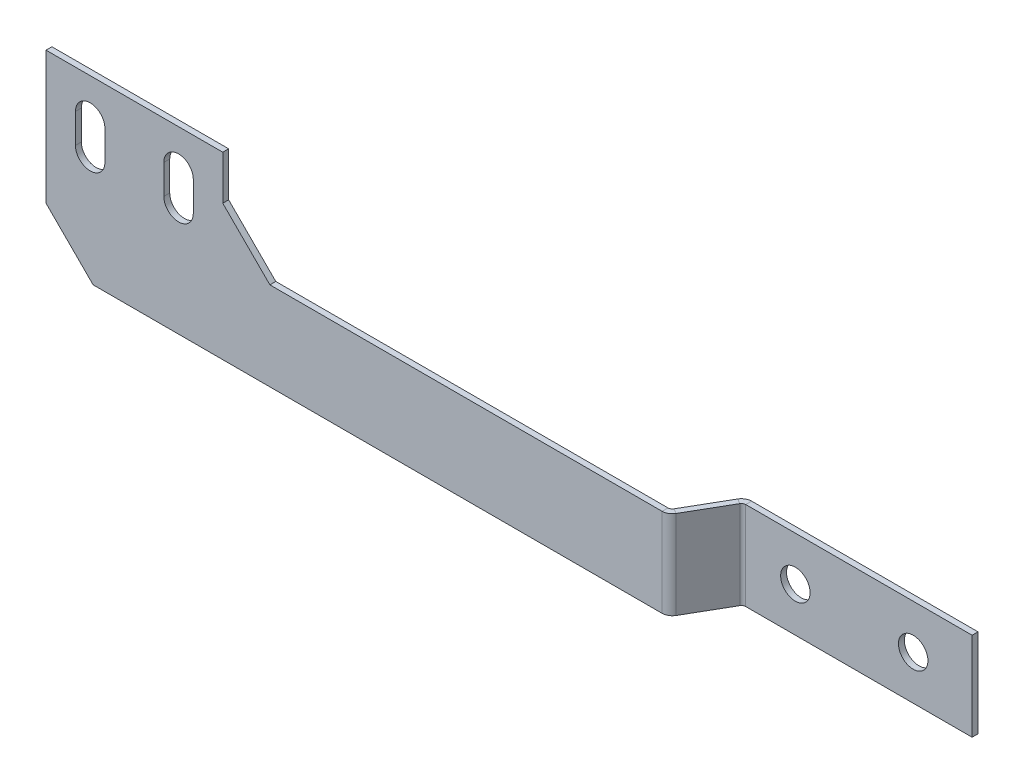
ISO-10303-21;
HEADER;
FILE_DESCRIPTION(('STEP AP214'),'2;1');
FILE_NAME('part.step','',(''),(''),'','','');
FILE_SCHEMA(('AUTOMOTIVE_DESIGN { 1 0 10303 214 1 1 1 1 }'));
ENDSEC;
DATA;
#1=APPLICATION_CONTEXT('core data for automotive mechanical design processes');
#2=APPLICATION_PROTOCOL_DEFINITION('international standard','automotive_design',2000,#1);
#3=PRODUCT_CONTEXT('',#1,'mechanical');
#4=PRODUCT('Part','Part','',(#3));
#5=PRODUCT_RELATED_PRODUCT_CATEGORY('part','',(#4));
#6=PRODUCT_DEFINITION_FORMATION('','',#4);
#7=PRODUCT_DEFINITION_CONTEXT('part definition',#1,'design');
#8=PRODUCT_DEFINITION('design','',#6,#7);
#9=PRODUCT_DEFINITION_SHAPE('','',#8);
#10=(LENGTH_UNIT() NAMED_UNIT(*) SI_UNIT(.MILLI.,.METRE.));
#11=(NAMED_UNIT(*) PLANE_ANGLE_UNIT() SI_UNIT($,.RADIAN.));
#12=(NAMED_UNIT(*) SI_UNIT($,.STERADIAN.) SOLID_ANGLE_UNIT());
#13=UNCERTAINTY_MEASURE_WITH_UNIT(LENGTH_MEASURE(1.E-05),#10,'distance_accuracy_value','');
#14=(GEOMETRIC_REPRESENTATION_CONTEXT(3) GLOBAL_UNCERTAINTY_ASSIGNED_CONTEXT((#13)) GLOBAL_UNIT_ASSIGNED_CONTEXT((#10,
#11,#12)) REPRESENTATION_CONTEXT('',''));
#15=CARTESIAN_POINT('',(0.,0.,0.));
#16=DIRECTION('',(0.,0.,1.));
#17=DIRECTION('',(1.,0.,0.));
#18=AXIS2_PLACEMENT_3D('',#15,#16,#17);
#19=CARTESIAN_POINT('',(-34.6726497308104,-7.5,8.09326673973658));
#20=DIRECTION('',(0.,1.,0.));
#21=DIRECTION('',(0.,0.,1.));
#22=AXIS2_PLACEMENT_3D('',#19,#20,#21);
#23=PLANE('',#22);
#24=DIRECTION('',(0.866025403784435,0.,0.500000000000006));
#25=VECTOR('',#24,1.);
#26=CARTESIAN_POINT('',(-33.8826613574782,-7.5,6.72496673973658));
#27=LINE('',#26,#25);
#28=CARTESIAN_POINT('',(-33.8826613574782,-7.5,6.72496673973658));
#29=VERTEX_POINT('',#28);
#30=CARTESIAN_POINT('',(-33.0166359536938,-7.5,7.22496673973658));
#31=VERTEX_POINT('',#30);
#32=EDGE_CURVE('E364',#29,#31,#27,.T.);
#33=ORIENTED_EDGE('',*,*,#32,.F.);
#34=DIRECTION('',(-0.500000000000004,0.,0.866025403784436));
#35=VECTOR('',#34,1.);
#36=CARTESIAN_POINT('',(-22.2113248654051,-7.5,-13.4903810567667));
#37=LINE('',#36,#35);
#38=CARTESIAN_POINT('',(-29.9239629695477,-7.5,-0.131700000000011));
#39=VERTEX_POINT('',#38);
#40=EDGE_CURVE('E373',#39,#29,#37,.T.);
#41=ORIENTED_EDGE('',*,*,#40,.F.);
#42=DIRECTION('',(0.866025403784436,0.,0.500000000000004));
#43=VECTOR('',#42,1.);
#44=CARTESIAN_POINT('',(-29.0579375657633,-7.5,0.368299999999995));
#45=LINE('',#44,#43);
#46=CARTESIAN_POINT('',(-29.0579375657633,-7.5,0.368299999999993));
#47=VERTEX_POINT('',#46);
#48=EDGE_CURVE('E384',#47,#39,#45,.F.);
#49=ORIENTED_EDGE('',*,*,#48,.F.);
#50=DIRECTION('',(0.500000000000004,0.,-0.866025403784436));
#51=VECTOR('',#50,1.);
#52=CARTESIAN_POINT('',(-33.806624327026,-7.5,8.59326673973658));
#53=LINE('',#52,#51);
#54=EDGE_CURVE('E378',#47,#31,#53,.F.);
#55=ORIENTED_EDGE('',*,*,#54,.T.);
#56=EDGE_LOOP('',(#33,#41,#49,#55));
#57=FACE_BOUND('',#56,.T.);
#58=ADVANCED_FACE('F91',(#57),#23,.F.);
#59=CARTESIAN_POINT('',(-29.7113248654052,7.5,-0.500000000000004));
#60=DIRECTION('',(0.,-1.,0.));
#61=DIRECTION('',(0.,0.,-1.));
#62=AXIS2_PLACEMENT_3D('',#59,#60,#61);
#63=PLANE('',#62);
#64=DIRECTION('',(0.866025403784435,0.,0.500000000000006));
#65=VECTOR('',#64,1.);
#66=CARTESIAN_POINT('',(-33.8826613574782,7.5,6.72496673973658));
#67=LINE('',#66,#65);
#68=CARTESIAN_POINT('',(-33.8826613574782,7.5,6.72496673973658));
#69=VERTEX_POINT('',#68);
#70=CARTESIAN_POINT('',(-33.0166359536938,7.5,7.22496673973659));
#71=VERTEX_POINT('',#70);
#72=EDGE_CURVE('E354',#69,#71,#67,.T.);
#73=ORIENTED_EDGE('',*,*,#72,.T.);
#74=DIRECTION('',(-0.500000000000004,0.,0.866025403784436));
#75=VECTOR('',#74,1.);
#76=CARTESIAN_POINT('',(-28.8452994616208,7.5,0.));
#77=LINE('',#76,#75);
#78=CARTESIAN_POINT('',(-29.0579375657633,7.49999999999999,0.368299999999993));
#79=VERTEX_POINT('',#78);
#80=EDGE_CURVE('E376',#71,#79,#77,.F.);
#81=ORIENTED_EDGE('',*,*,#80,.T.);
#82=DIRECTION('',(0.866025403784436,0.,0.500000000000004));
#83=VECTOR('',#82,1.);
#84=CARTESIAN_POINT('',(-29.9239629695477,7.5,-0.131700000000007));
#85=LINE('',#84,#83);
#86=CARTESIAN_POINT('',(-29.9239629695477,7.49999999999999,-0.131700000000011));
#87=VERTEX_POINT('',#86);
#88=EDGE_CURVE('E367',#79,#87,#85,.F.);
#89=ORIENTED_EDGE('',*,*,#88,.T.);
#90=DIRECTION('',(0.500000000000004,0.,-0.866025403784436));
#91=VECTOR('',#90,1.);
#92=CARTESIAN_POINT('',(-22.2113248654051,7.5,-13.4903810567667));
#93=LINE('',#92,#91);
#94=EDGE_CURVE('E370',#69,#87,#93,.T.);
#95=ORIENTED_EDGE('',*,*,#94,.F.);
#96=EDGE_LOOP('',(#73,#81,#89,#95));
#97=FACE_BOUND('',#96,.T.);
#98=ADVANCED_FACE('F500',(#97),#63,.F.);
#99=CARTESIAN_POINT('',(-22.2113248654051,0.,-13.4903810567667));
#100=DIRECTION('',(0.866025403784436,0.,0.500000000000004));
#101=DIRECTION('',(0.500000000000004,0.,-0.866025403784436));
#102=AXIS2_PLACEMENT_3D('',#99,#100,#101);
#103=PLANE('',#102);
#104=DIRECTION('',(0.,1.,0.));
#105=VECTOR('',#104,1.);
#106=CARTESIAN_POINT('',(-33.8826613574782,7.5,6.72496673973658));
#107=LINE('',#106,#105);
#108=EDGE_CURVE('E360',#69,#29,#107,.F.);
#109=ORIENTED_EDGE('',*,*,#108,.F.);
#110=ORIENTED_EDGE('',*,*,#94,.T.);
#111=DIRECTION('',(0.,-1.,0.));
#112=VECTOR('',#111,1.);
#113=CARTESIAN_POINT('',(-29.9239629695477,7.5,-0.131700000000011));
#114=LINE('',#113,#112);
#115=EDGE_CURVE('E381',#39,#87,#114,.F.);
#116=ORIENTED_EDGE('',*,*,#115,.F.);
#117=ORIENTED_EDGE('',*,*,#40,.T.);
#118=EDGE_LOOP('',(#109,#110,#116,#117));
#119=FACE_BOUND('',#118,.T.);
#120=ADVANCED_FACE('F506',(#119),#103,.F.);
#121=CARTESIAN_POINT('',(-21.3452994616206,0.,-12.9903810567667));
#122=DIRECTION('',(0.866025403784436,0.,0.500000000000004));
#123=DIRECTION('',(0.500000000000004,0.,-0.866025403784436));
#124=AXIS2_PLACEMENT_3D('',#121,#122,#123);
#125=PLANE('',#124);
#126=ORIENTED_EDGE('',*,*,#80,.F.);
#127=DIRECTION('',(0.,1.,0.));
#128=VECTOR('',#127,1.);
#129=CARTESIAN_POINT('',(-33.0166359536938,7.5,7.22496673973659));
#130=LINE('',#129,#128);
#131=EDGE_CURVE('E347',#71,#31,#130,.F.);
#132=ORIENTED_EDGE('',*,*,#131,.T.);
#133=ORIENTED_EDGE('',*,*,#54,.F.);
#134=DIRECTION('',(0.,-1.,0.));
#135=VECTOR('',#134,1.);
#136=CARTESIAN_POINT('',(-29.0579375657633,7.5,0.368299999999995));
#137=LINE('',#136,#135);
#138=EDGE_CURVE('E387',#79,#47,#137,.T.);
#139=ORIENTED_EDGE('',*,*,#138,.F.);
#140=EDGE_LOOP('',(#126,#132,#133,#139));
#141=FACE_BOUND('',#140,.T.);
#142=ADVANCED_FACE('F555',(#141),#125,.T.);
#143=CARTESIAN_POINT('',(10.,-7.5,-1.));
#144=DIRECTION('',(0.,-1.,0.));
#145=DIRECTION('',(0.,0.,-1.));
#146=AXIS2_PLACEMENT_3D('',#143,#144,#145);
#147=PLANE('',#146);
#148=DIRECTION('',(1.,0.,0.));
#149=VECTOR('',#148,1.);
#150=CARTESIAN_POINT('',(10.,-7.5,0.));
#151=LINE('',#150,#149);
#152=CARTESIAN_POINT('',(-28.4200232533357,-7.5,0.));
#153=VERTEX_POINT('',#152);
#154=CARTESIAN_POINT('',(10.,-7.5,0.));
#155=VERTEX_POINT('',#154);
#156=EDGE_CURVE('E423',#153,#155,#151,.T.);
#157=ORIENTED_EDGE('',*,*,#156,.F.);
#158=DIRECTION('',(0.,0.,-1.));
#159=VECTOR('',#158,1.);
#160=CARTESIAN_POINT('',(-28.4200232533357,-7.5,0.));
#161=LINE('',#160,#159);
#162=CARTESIAN_POINT('',(-28.4200232533357,-7.5,-1.));
#163=VERTEX_POINT('',#162);
#164=EDGE_CURVE('E398',#153,#163,#161,.T.);
#165=ORIENTED_EDGE('',*,*,#164,.T.);
#166=DIRECTION('',(1.,0.,0.));
#167=VECTOR('',#166,1.);
#168=CARTESIAN_POINT('',(10.,-7.5,-1.));
#169=LINE('',#168,#167);
#170=CARTESIAN_POINT('',(10.,-7.5,-1.));
#171=VERTEX_POINT('',#170);
#172=EDGE_CURVE('E426',#163,#171,#169,.T.);
#173=ORIENTED_EDGE('',*,*,#172,.T.);
#174=DIRECTION('',(0.,0.,1.));
#175=VECTOR('',#174,1.);
#176=CARTESIAN_POINT('',(10.,-7.5,-1.));
#177=LINE('',#176,#175);
#178=EDGE_CURVE('E435',#171,#155,#177,.T.);
#179=ORIENTED_EDGE('',*,*,#178,.T.);
#180=EDGE_LOOP('',(#157,#165,#173,#179));
#181=FACE_BOUND('',#180,.T.);
#182=ADVANCED_FACE('F542',(#181),#147,.T.);
#183=CARTESIAN_POINT('',(0.,0.,-1.));
#184=DIRECTION('',(0.,0.,-1.));
#185=DIRECTION('',(-1.,0.,0.));
#186=AXIS2_PLACEMENT_3D('',#183,#184,#185);
#187=PLANE('',#186);
#188=CARTESIAN_POINT('',(0.,0.,-1.));
#189=DIRECTION('',(0.,0.,1.));
#190=DIRECTION('',(1.,0.,0.));
#191=AXIS2_PLACEMENT_3D('',#188,#189,#190);
#192=CIRCLE('',#191,2.5);
#193=CARTESIAN_POINT('',(2.5,0.,-1.));
#194=VERTEX_POINT('',#193);
#195=EDGE_CURVE('E414',#194,#194,#192,.T.);
#196=ORIENTED_EDGE('',*,*,#195,.T.);
#197=EDGE_LOOP('',(#196));
#198=FACE_BOUND('',#197,.T.);
#199=CARTESIAN_POINT('',(-20.,0.,-1.));
#200=DIRECTION('',(0.,0.,1.));
#201=DIRECTION('',(1.,0.,0.));
#202=AXIS2_PLACEMENT_3D('',#199,#200,#201);
#203=CIRCLE('',#202,2.5);
#204=CARTESIAN_POINT('',(-17.5,0.,-1.));
#205=VERTEX_POINT('',#204);
#206=EDGE_CURVE('E420',#205,#205,#203,.T.);
#207=ORIENTED_EDGE('',*,*,#206,.T.);
#208=EDGE_LOOP('',(#207));
#209=FACE_BOUND('',#208,.T.);
#210=ORIENTED_EDGE('',*,*,#172,.F.);
#211=DIRECTION('',(0.,-1.,0.));
#212=VECTOR('',#211,1.);
#213=CARTESIAN_POINT('',(-28.4200232533357,-7.5,-1.));
#214=LINE('',#213,#212);
#215=CARTESIAN_POINT('',(-28.4200232533357,7.5,-1.));
#216=VERTEX_POINT('',#215);
#217=EDGE_CURVE('E391',#163,#216,#214,.F.);
#218=ORIENTED_EDGE('',*,*,#217,.T.);
#219=DIRECTION('',(-1.,0.,0.));
#220=VECTOR('',#219,1.);
#221=CARTESIAN_POINT('',(-30.,7.5,-1.));
#222=LINE('',#221,#220);
#223=CARTESIAN_POINT('',(10.,7.5,-1.));
#224=VERTEX_POINT('',#223);
#225=EDGE_CURVE('E432',#224,#216,#222,.T.);
#226=ORIENTED_EDGE('',*,*,#225,.F.);
#227=DIRECTION('',(0.,1.,0.));
#228=VECTOR('',#227,1.);
#229=CARTESIAN_POINT('',(10.,7.5,-1.));
#230=LINE('',#229,#228);
#231=EDGE_CURVE('E428',#171,#224,#230,.T.);
#232=ORIENTED_EDGE('',*,*,#231,.F.);
#233=EDGE_LOOP('',(#210,#218,#226,#232));
#234=FACE_BOUND('',#233,.T.);
#235=ADVANCED_FACE('F538',(#198,#209,#234),#187,.T.);
#236=CARTESIAN_POINT('',(0.,0.,0.));
#237=DIRECTION('',(0.,0.,-1.));
#238=DIRECTION('',(-1.,0.,0.));
#239=AXIS2_PLACEMENT_3D('',#236,#237,#238);
#240=PLANE('',#239);
#241=CARTESIAN_POINT('',(-20.,0.,0.));
#242=DIRECTION('',(0.,0.,1.));
#243=DIRECTION('',(1.,0.,0.));
#244=AXIS2_PLACEMENT_3D('',#241,#242,#243);
#245=CIRCLE('',#244,2.5);
#246=CARTESIAN_POINT('',(-17.5,0.,0.));
#247=VERTEX_POINT('',#246);
#248=EDGE_CURVE('E417',#247,#247,#245,.T.);
#249=ORIENTED_EDGE('',*,*,#248,.F.);
#250=EDGE_LOOP('',(#249));
#251=FACE_BOUND('',#250,.T.);
#252=CARTESIAN_POINT('',(0.,0.,0.));
#253=DIRECTION('',(0.,0.,1.));
#254=DIRECTION('',(1.,0.,0.));
#255=AXIS2_PLACEMENT_3D('',#252,#253,#254);
#256=CIRCLE('',#255,2.5);
#257=CARTESIAN_POINT('',(2.5,0.,0.));
#258=VERTEX_POINT('',#257);
#259=EDGE_CURVE('E411',#258,#258,#256,.T.);
#260=ORIENTED_EDGE('',*,*,#259,.F.);
#261=EDGE_LOOP('',(#260));
#262=FACE_BOUND('',#261,.T.);
#263=DIRECTION('',(0.,-1.,0.));
#264=VECTOR('',#263,1.);
#265=CARTESIAN_POINT('',(-28.4200232533357,-7.5,0.));
#266=LINE('',#265,#264);
#267=CARTESIAN_POINT('',(-28.4200232533357,7.49999999999999,0.));
#268=VERTEX_POINT('',#267);
#269=EDGE_CURVE('E404',#153,#268,#266,.F.);
#270=ORIENTED_EDGE('',*,*,#269,.F.);
#271=ORIENTED_EDGE('',*,*,#156,.T.);
#272=DIRECTION('',(0.,1.,0.));
#273=VECTOR('',#272,1.);
#274=CARTESIAN_POINT('',(10.,7.5,0.));
#275=LINE('',#274,#273);
#276=CARTESIAN_POINT('',(10.,7.5,0.));
#277=VERTEX_POINT('',#276);
#278=EDGE_CURVE('E437',#155,#277,#275,.T.);
#279=ORIENTED_EDGE('',*,*,#278,.T.);
#280=DIRECTION('',(-1.,0.,0.));
#281=VECTOR('',#280,1.);
#282=CARTESIAN_POINT('',(-30.,7.5,0.));
#283=LINE('',#282,#281);
#284=EDGE_CURVE('E429',#277,#268,#283,.T.);
#285=ORIENTED_EDGE('',*,*,#284,.T.);
#286=EDGE_LOOP('',(#270,#271,#279,#285));
#287=FACE_BOUND('',#286,.T.);
#288=ADVANCED_FACE('F541',(#251,#262,#287),#240,.F.);
#289=CARTESIAN_POINT('',(-30.,7.5,-1.));
#290=DIRECTION('',(0.,1.,0.));
#291=DIRECTION('',(-1.,0.,0.));
#292=AXIS2_PLACEMENT_3D('',#289,#290,#291);
#293=PLANE('',#292);
#294=DIRECTION('',(0.,0.,-1.));
#295=VECTOR('',#294,1.);
#296=CARTESIAN_POINT('',(-28.4200232533357,7.49999999999999,0.));
#297=LINE('',#296,#295);
#298=EDGE_CURVE('E408',#268,#216,#297,.T.);
#299=ORIENTED_EDGE('',*,*,#298,.F.);
#300=ORIENTED_EDGE('',*,*,#284,.F.);
#301=DIRECTION('',(0.,0.,1.));
#302=VECTOR('',#301,1.);
#303=CARTESIAN_POINT('',(10.,7.5,-1.));
#304=LINE('',#303,#302);
#305=EDGE_CURVE('E442',#224,#277,#304,.T.);
#306=ORIENTED_EDGE('',*,*,#305,.F.);
#307=ORIENTED_EDGE('',*,*,#225,.T.);
#308=EDGE_LOOP('',(#299,#300,#306,#307));
#309=FACE_BOUND('',#308,.T.);
#310=ADVANCED_FACE('F546',(#309),#293,.T.);
#311=CARTESIAN_POINT('',(10.,7.5,-1.));
#312=DIRECTION('',(1.,0.,0.));
#313=DIRECTION('',(0.,0.,-1.));
#314=AXIS2_PLACEMENT_3D('',#311,#312,#313);
#315=PLANE('',#314);
#316=ORIENTED_EDGE('',*,*,#278,.F.);
#317=ORIENTED_EDGE('',*,*,#178,.F.);
#318=ORIENTED_EDGE('',*,*,#231,.T.);
#319=ORIENTED_EDGE('',*,*,#305,.T.);
#320=EDGE_LOOP('',(#316,#317,#318,#319));
#321=FACE_BOUND('',#320,.T.);
#322=ADVANCED_FACE('F536',(#321),#315,.T.);
#323=CARTESIAN_POINT('',(-20.,0.,-1.));
#324=DIRECTION('',(0.,0.,1.));
#325=DIRECTION('',(1.,0.,0.));
#326=AXIS2_PLACEMENT_3D('',#323,#324,#325);
#327=CYLINDRICAL_SURFACE('',#326,2.5);
#328=ORIENTED_EDGE('',*,*,#206,.F.);
#329=EDGE_LOOP('',(#328));
#330=FACE_BOUND('',#329,.T.);
#331=ORIENTED_EDGE('',*,*,#248,.T.);
#332=EDGE_LOOP('',(#331));
#333=FACE_BOUND('',#332,.T.);
#334=ADVANCED_FACE('F532',(#330,#333),#327,.F.);
#335=CARTESIAN_POINT('',(0.,0.,-1.));
#336=DIRECTION('',(0.,0.,1.));
#337=DIRECTION('',(1.,0.,0.));
#338=AXIS2_PLACEMENT_3D('',#335,#336,#337);
#339=CYLINDRICAL_SURFACE('',#338,2.5);
#340=ORIENTED_EDGE('',*,*,#195,.F.);
#341=EDGE_LOOP('',(#340));
#342=FACE_BOUND('',#341,.T.);
#343=ORIENTED_EDGE('',*,*,#259,.T.);
#344=EDGE_LOOP('',(#343));
#345=FACE_BOUND('',#344,.T.);
#346=ADVANCED_FACE('F525',(#342,#345),#339,.F.);
#347=CARTESIAN_POINT('',(-28.4200232533357,7.49999999999999,0.736599999999995));
#348=DIRECTION('',(0.,1.,0.));
#349=DIRECTION('',(0.,0.,1.));
#350=AXIS2_PLACEMENT_3D('',#347,#348,#349);
#351=PLANE('',#350);
#352=ORIENTED_EDGE('',*,*,#88,.F.);
#353=CARTESIAN_POINT('',(-28.4200232533357,7.49999999999999,0.736599999999995));
#354=DIRECTION('',(0.,-1.,0.));
#355=DIRECTION('',(0.,0.,-1.));
#356=AXIS2_PLACEMENT_3D('',#353,#354,#355);
#357=CIRCLE('',#356,0.736599999999998);
#358=EDGE_CURVE('E401',#268,#79,#357,.F.);
#359=ORIENTED_EDGE('',*,*,#358,.F.);
#360=ORIENTED_EDGE('',*,*,#298,.T.);
#361=CARTESIAN_POINT('',(-28.4200232533357,7.49999999999999,0.736599999999995));
#362=DIRECTION('',(0.,-1.,0.));
#363=DIRECTION('',(0.,0.,-1.));
#364=AXIS2_PLACEMENT_3D('',#361,#362,#363);
#365=CIRCLE('',#364,1.7366);
#366=EDGE_CURVE('E394',#216,#87,#365,.F.);
#367=ORIENTED_EDGE('',*,*,#366,.T.);
#368=EDGE_LOOP('',(#352,#359,#360,#367));
#369=FACE_BOUND('',#368,.T.);
#370=ADVANCED_FACE('F522',(#369),#351,.T.);
#371=CARTESIAN_POINT('',(-28.4200232533357,-7.5,0.736599999999995));
#372=DIRECTION('',(0.,1.,0.));
#373=DIRECTION('',(0.,0.,1.));
#374=AXIS2_PLACEMENT_3D('',#371,#372,#373);
#375=PLANE('',#374);
#376=CARTESIAN_POINT('',(-28.4200232533357,-7.5,0.736599999999995));
#377=DIRECTION('',(0.,-1.,0.));
#378=DIRECTION('',(0.,0.,-1.));
#379=AXIS2_PLACEMENT_3D('',#376,#377,#378);
#380=CIRCLE('',#379,0.736599999999998);
#381=EDGE_CURVE('E372',#47,#153,#380,.T.);
#382=ORIENTED_EDGE('',*,*,#381,.F.);
#383=ORIENTED_EDGE('',*,*,#48,.T.);
#384=CARTESIAN_POINT('',(-28.4200232533357,-7.5,0.736599999999995));
#385=DIRECTION('',(0.,-1.,0.));
#386=DIRECTION('',(0.,0.,-1.));
#387=AXIS2_PLACEMENT_3D('',#384,#385,#386);
#388=CIRCLE('',#387,1.7366);
#389=EDGE_CURVE('E395',#39,#163,#388,.T.);
#390=ORIENTED_EDGE('',*,*,#389,.T.);
#391=ORIENTED_EDGE('',*,*,#164,.F.);
#392=EDGE_LOOP('',(#382,#383,#390,#391));
#393=FACE_BOUND('',#392,.T.);
#394=ADVANCED_FACE('F516',(#393),#375,.F.);
#395=CARTESIAN_POINT('',(-28.4200232533357,-7.5,0.736599999999995));
#396=DIRECTION('',(0.,-1.,0.));
#397=DIRECTION('',(-0.866025403784436,0.,-0.500000000000004));
#398=AXIS2_PLACEMENT_3D('',#395,#396,#397);
#399=CYLINDRICAL_SURFACE('',#398,1.7366);
#400=ORIENTED_EDGE('',*,*,#217,.F.);
#401=ORIENTED_EDGE('',*,*,#389,.F.);
#402=ORIENTED_EDGE('',*,*,#115,.T.);
#403=ORIENTED_EDGE('',*,*,#366,.F.);
#404=EDGE_LOOP('',(#400,#401,#402,#403));
#405=FACE_BOUND('',#404,.T.);
#406=ADVANCED_FACE('F512',(#405),#399,.T.);
#407=CARTESIAN_POINT('',(-28.4200232533357,-7.5,0.736599999999995));
#408=DIRECTION('',(0.,-1.,0.));
#409=DIRECTION('',(-0.866025403784436,0.,-0.500000000000004));
#410=AXIS2_PLACEMENT_3D('',#407,#408,#409);
#411=CYLINDRICAL_SURFACE('',#410,0.736599999999998);
#412=ORIENTED_EDGE('',*,*,#269,.T.);
#413=ORIENTED_EDGE('',*,*,#358,.T.);
#414=ORIENTED_EDGE('',*,*,#138,.T.);
#415=ORIENTED_EDGE('',*,*,#381,.T.);
#416=EDGE_LOOP('',(#412,#413,#414,#415));
#417=FACE_BOUND('',#416,.T.);
#418=ADVANCED_FACE('F515',(#417),#411,.F.);
#419=CARTESIAN_POINT('',(-34.5205756699059,-7.5,6.35666673973658));
#420=DIRECTION('',(0.,-1.,0.));
#421=DIRECTION('',(0.,0.,-1.));
#422=AXIS2_PLACEMENT_3D('',#419,#420,#421);
#423=PLANE('',#422);
#424=DIRECTION('',(0.,0.,-1.));
#425=VECTOR('',#424,1.);
#426=CARTESIAN_POINT('',(-34.5205756699059,-7.5,8.09326673973658));
#427=LINE('',#426,#425);
#428=CARTESIAN_POINT('',(-34.5205756699059,-7.5,7.09326673973658));
#429=VERTEX_POINT('',#428);
#430=CARTESIAN_POINT('',(-34.5205756699059,-7.5,8.09326673973658));
#431=VERTEX_POINT('',#430);
#432=EDGE_CURVE('E284',#429,#431,#427,.F.);
#433=ORIENTED_EDGE('',*,*,#432,.F.);
#434=CARTESIAN_POINT('',(-34.5205756699059,-7.5,6.35666673973658));
#435=DIRECTION('',(0.,1.,0.));
#436=DIRECTION('',(0.,0.,1.));
#437=AXIS2_PLACEMENT_3D('',#434,#435,#436);
#438=CIRCLE('',#437,0.736600000000001);
#439=EDGE_CURVE('E357',#29,#429,#438,.F.);
#440=ORIENTED_EDGE('',*,*,#439,.F.);
#441=ORIENTED_EDGE('',*,*,#32,.T.);
#442=CARTESIAN_POINT('',(-34.5205756699059,-7.5,6.35666673973658));
#443=DIRECTION('',(0.,1.,0.));
#444=DIRECTION('',(0.,0.,1.));
#445=AXIS2_PLACEMENT_3D('',#442,#443,#444);
#446=CIRCLE('',#445,1.7366);
#447=EDGE_CURVE('E350',#31,#431,#446,.F.);
#448=ORIENTED_EDGE('',*,*,#447,.T.);
#449=EDGE_LOOP('',(#433,#440,#441,#448));
#450=FACE_BOUND('',#449,.T.);
#451=ADVANCED_FACE('F520',(#450),#423,.T.);
#452=CARTESIAN_POINT('',(-34.5205756699059,7.5,6.35666673973658));
#453=DIRECTION('',(0.,-1.,0.));
#454=DIRECTION('',(0.,0.,-1.));
#455=AXIS2_PLACEMENT_3D('',#452,#453,#454);
#456=PLANE('',#455);
#457=CARTESIAN_POINT('',(-34.5205756699059,7.5,6.35666673973658));
#458=DIRECTION('',(0.,1.,0.));
#459=DIRECTION('',(0.,0.,1.));
#460=AXIS2_PLACEMENT_3D('',#457,#458,#459);
#461=CIRCLE('',#460,0.736600000000001);
#462=CARTESIAN_POINT('',(-34.5205756699059,7.5,7.09326673973658));
#463=VERTEX_POINT('',#462);
#464=EDGE_CURVE('E308',#463,#69,#461,.T.);
#465=ORIENTED_EDGE('',*,*,#464,.F.);
#466=DIRECTION('',(0.,0.,-1.));
#467=VECTOR('',#466,1.);
#468=CARTESIAN_POINT('',(-34.5205756699059,7.5,7.09326673973658));
#469=LINE('',#468,#467);
#470=CARTESIAN_POINT('',(-34.5205756699059,7.5,8.09326673973658));
#471=VERTEX_POINT('',#470);
#472=EDGE_CURVE('E340',#463,#471,#469,.F.);
#473=ORIENTED_EDGE('',*,*,#472,.T.);
#474=CARTESIAN_POINT('',(-34.5205756699059,7.5,6.35666673973658));
#475=DIRECTION('',(0.,1.,0.));
#476=DIRECTION('',(0.,0.,1.));
#477=AXIS2_PLACEMENT_3D('',#474,#475,#476);
#478=CIRCLE('',#477,1.7366);
#479=EDGE_CURVE('E351',#471,#71,#478,.T.);
#480=ORIENTED_EDGE('',*,*,#479,.T.);
#481=ORIENTED_EDGE('',*,*,#72,.F.);
#482=EDGE_LOOP('',(#465,#473,#480,#481));
#483=FACE_BOUND('',#482,.T.);
#484=ADVANCED_FACE('F600',(#483),#456,.F.);
#485=CARTESIAN_POINT('',(-34.5205756699059,7.5,6.35666673973658));
#486=DIRECTION('',(0.,1.,0.));
#487=DIRECTION('',(0.,0.,1.));
#488=AXIS2_PLACEMENT_3D('',#485,#486,#487);
#489=CYLINDRICAL_SURFACE('',#488,1.7366);
#490=ORIENTED_EDGE('',*,*,#131,.F.);
#491=ORIENTED_EDGE('',*,*,#479,.F.);
#492=DIRECTION('',(0.,1.,0.));
#493=VECTOR('',#492,1.);
#494=CARTESIAN_POINT('',(-34.5205756699059,0.,8.09326673973658));
#495=LINE('',#494,#493);
#496=EDGE_CURVE('E337',#431,#471,#495,.T.);
#497=ORIENTED_EDGE('',*,*,#496,.F.);
#498=ORIENTED_EDGE('',*,*,#447,.F.);
#499=EDGE_LOOP('',(#490,#491,#497,#498));
#500=FACE_BOUND('',#499,.T.);
#501=ADVANCED_FACE('F603',(#500),#489,.T.);
#502=CARTESIAN_POINT('',(-34.5205756699059,7.5,6.35666673973658));
#503=DIRECTION('',(0.,1.,0.));
#504=DIRECTION('',(0.,0.,1.));
#505=AXIS2_PLACEMENT_3D('',#502,#503,#504);
#506=CYLINDRICAL_SURFACE('',#505,0.736600000000001);
#507=ORIENTED_EDGE('',*,*,#108,.T.);
#508=ORIENTED_EDGE('',*,*,#439,.T.);
#509=DIRECTION('',(0.,-1.,0.));
#510=VECTOR('',#509,1.);
#511=CARTESIAN_POINT('',(-34.5205756699059,-7.5,7.09326673973658));
#512=LINE('',#511,#510);
#513=EDGE_CURVE('E343',#429,#463,#512,.F.);
#514=ORIENTED_EDGE('',*,*,#513,.T.);
#515=ORIENTED_EDGE('',*,*,#464,.T.);
#516=EDGE_LOOP('',(#507,#508,#514,#515));
#517=FACE_BOUND('',#516,.T.);
#518=ADVANCED_FACE('F588',(#517),#506,.F.);
#519=CARTESIAN_POINT('',(-34.0952994616208,7.5,8.09326673973658));
#520=DIRECTION('',(0.,-1.,0.));
#521=DIRECTION('',(0.,0.,-1.));
#522=AXIS2_PLACEMENT_3D('',#519,#520,#521);
#523=PLANE('',#522);
#524=DIRECTION('',(-1.,0.,0.));
#525=VECTOR('',#524,1.);
#526=CARTESIAN_POINT('',(-34.0952994616208,7.5,7.09326673973658));
#527=LINE('',#526,#525);
#528=CARTESIAN_POINT('',(-101.095299461621,7.5,7.09326673973658));
#529=VERTEX_POINT('',#528);
#530=EDGE_CURVE('E334',#463,#529,#527,.T.);
#531=ORIENTED_EDGE('',*,*,#530,.T.);
#532=DIRECTION('',(0.,0.,1.));
#533=VECTOR('',#532,1.);
#534=CARTESIAN_POINT('',(-101.095299461621,7.5,8.09326673973658));
#535=LINE('',#534,#533);
#536=CARTESIAN_POINT('',(-101.095299461621,7.5,8.09326673973658));
#537=VERTEX_POINT('',#536);
#538=EDGE_CURVE('E458',#529,#537,#535,.T.);
#539=ORIENTED_EDGE('',*,*,#538,.T.);
#540=DIRECTION('',(1.,0.,0.));
#541=VECTOR('',#540,1.);
#542=CARTESIAN_POINT('',(0.577350269189632,7.5,8.09326673973658));
#543=LINE('',#542,#541);
#544=EDGE_CURVE('E321',#471,#537,#543,.F.);
#545=ORIENTED_EDGE('',*,*,#544,.F.);
#546=ORIENTED_EDGE('',*,*,#472,.F.);
#547=EDGE_LOOP('',(#531,#539,#545,#546));
#548=FACE_BOUND('',#547,.T.);
#549=ADVANCED_FACE('F598',(#548),#523,.F.);
#550=CARTESIAN_POINT('',(-34.0952994616208,-7.5,8.09326673973658));
#551=DIRECTION('',(0.,1.,0.));
#552=DIRECTION('',(0.,0.,1.));
#553=AXIS2_PLACEMENT_3D('',#550,#551,#552);
#554=PLANE('',#553);
#555=DIRECTION('',(-1.,0.,0.));
#556=VECTOR('',#555,1.);
#557=CARTESIAN_POINT('',(0.577350269189632,-7.5,8.09326673973658));
#558=LINE('',#557,#556);
#559=CARTESIAN_POINT('',(-131.095299461621,-7.5,8.09326673973658));
#560=VERTEX_POINT('',#559);
#561=EDGE_CURVE('E312',#560,#431,#558,.F.);
#562=ORIENTED_EDGE('',*,*,#561,.F.);
#563=DIRECTION('',(0.,0.,-1.));
#564=VECTOR('',#563,1.);
#565=CARTESIAN_POINT('',(-131.095299461621,-7.5,8.09326673973658));
#566=LINE('',#565,#564);
#567=CARTESIAN_POINT('',(-131.095299461621,-7.5,7.09326673973658));
#568=VERTEX_POINT('',#567);
#569=EDGE_CURVE('E444',#560,#568,#566,.T.);
#570=ORIENTED_EDGE('',*,*,#569,.T.);
#571=DIRECTION('',(1.,0.,0.));
#572=VECTOR('',#571,1.);
#573=CARTESIAN_POINT('',(-34.0952994616208,-7.5,7.09326673973658));
#574=LINE('',#573,#572);
#575=EDGE_CURVE('E324',#568,#429,#574,.T.);
#576=ORIENTED_EDGE('',*,*,#575,.T.);
#577=ORIENTED_EDGE('',*,*,#432,.T.);
#578=EDGE_LOOP('',(#562,#570,#576,#577));
#579=FACE_BOUND('',#578,.T.);
#580=ADVANCED_FACE('F581',(#579),#554,.F.);
#581=CARTESIAN_POINT('',(0.577350269189632,0.,8.09326673973658));
#582=DIRECTION('',(0.,0.,1.));
#583=DIRECTION('',(1.,0.,0.));
#584=AXIS2_PLACEMENT_3D('',#581,#582,#583);
#585=PLANE('',#584);
#586=CARTESIAN_POINT('',(-131.595299461621,16.5,8.09326673973658));
#587=DIRECTION('',(0.,0.,1.));
#588=DIRECTION('',(1.,0.,0.));
#589=AXIS2_PLACEMENT_3D('',#586,#587,#588);
#590=CIRCLE('',#589,2.5);
#591=CARTESIAN_POINT('',(-129.095299461621,16.5,8.09326673973658));
#592=VERTEX_POINT('',#591);
#593=CARTESIAN_POINT('',(-134.095299461621,16.5,8.09326673973658));
#594=VERTEX_POINT('',#593);
#595=EDGE_CURVE('E107',#592,#594,#590,.T.);
#596=ORIENTED_EDGE('',*,*,#595,.F.);
#597=DIRECTION('',(0.,1.,0.));
#598=VECTOR('',#597,1.);
#599=CARTESIAN_POINT('',(-129.095299461621,16.5,8.09326673973658));
#600=LINE('',#599,#598);
#601=CARTESIAN_POINT('',(-129.095299461621,11.5,8.09326673973658));
#602=VERTEX_POINT('',#601);
#603=EDGE_CURVE('E277',#602,#592,#600,.T.);
#604=ORIENTED_EDGE('',*,*,#603,.F.);
#605=CARTESIAN_POINT('',(-131.595299461621,11.5,8.09326673973658));
#606=DIRECTION('',(0.,0.,1.));
#607=DIRECTION('',(1.,0.,0.));
#608=AXIS2_PLACEMENT_3D('',#605,#606,#607);
#609=CIRCLE('',#608,2.5);
#610=CARTESIAN_POINT('',(-134.095299461621,11.5,8.09326673973658));
#611=VERTEX_POINT('',#610);
#612=EDGE_CURVE('E260',#611,#602,#609,.T.);
#613=ORIENTED_EDGE('',*,*,#612,.F.);
#614=DIRECTION('',(0.,-1.,0.));
#615=VECTOR('',#614,1.);
#616=CARTESIAN_POINT('',(-134.095299461621,16.5,8.09326673973658));
#617=LINE('',#616,#615);
#618=EDGE_CURVE('E270',#594,#611,#617,.T.);
#619=ORIENTED_EDGE('',*,*,#618,.F.);
#620=EDGE_LOOP('',(#596,#604,#613,#619));
#621=FACE_BOUND('',#620,.T.);
#622=CARTESIAN_POINT('',(-116.595299461621,16.5,8.09326673973658));
#623=DIRECTION('',(0.,0.,1.));
#624=DIRECTION('',(1.,0.,0.));
#625=AXIS2_PLACEMENT_3D('',#622,#623,#624);
#626=CIRCLE('',#625,2.5);
#627=CARTESIAN_POINT('',(-114.095299461621,16.5,8.09326673973658));
#628=VERTEX_POINT('',#627);
#629=CARTESIAN_POINT('',(-119.095299461621,16.5,8.09326673973658));
#630=VERTEX_POINT('',#629);
#631=EDGE_CURVE('E115',#628,#630,#626,.T.);
#632=ORIENTED_EDGE('',*,*,#631,.F.);
#633=DIRECTION('',(0.,1.,0.));
#634=VECTOR('',#633,1.);
#635=CARTESIAN_POINT('',(-114.095299461621,16.5,8.09326673973658));
#636=LINE('',#635,#634);
#637=CARTESIAN_POINT('',(-114.095299461621,11.5,8.09326673973658));
#638=VERTEX_POINT('',#637);
#639=EDGE_CURVE('E294',#638,#628,#636,.T.);
#640=ORIENTED_EDGE('',*,*,#639,.F.);
#641=CARTESIAN_POINT('',(-116.595299461621,11.5,8.09326673973658));
#642=DIRECTION('',(0.,0.,1.));
#643=DIRECTION('',(1.,0.,0.));
#644=AXIS2_PLACEMENT_3D('',#641,#642,#643);
#645=CIRCLE('',#644,2.5);
#646=CARTESIAN_POINT('',(-119.095299461621,11.5,8.09326673973658));
#647=VERTEX_POINT('',#646);
#648=EDGE_CURVE('E291',#647,#638,#645,.T.);
#649=ORIENTED_EDGE('',*,*,#648,.F.);
#650=DIRECTION('',(0.,-1.,0.));
#651=VECTOR('',#650,1.);
#652=CARTESIAN_POINT('',(-119.095299461621,16.5,8.09326673973658));
#653=LINE('',#652,#651);
#654=EDGE_CURVE('E288',#630,#647,#653,.T.);
#655=ORIENTED_EDGE('',*,*,#654,.F.);
#656=EDGE_LOOP('',(#632,#640,#649,#655));
#657=FACE_BOUND('',#656,.T.);
#658=DIRECTION('',(0.,1.,0.));
#659=VECTOR('',#658,1.);
#660=CARTESIAN_POINT('',(-139.095299461621,0.,8.09326673973658));
#661=LINE('',#660,#659);
#662=CARTESIAN_POINT('',(-139.095299461621,23.,8.09326673973658));
#663=VERTEX_POINT('',#662);
#664=CARTESIAN_POINT('',(-139.095299461621,0.500000000000038,8.09326673973658));
#665=VERTEX_POINT('',#664);
#666=EDGE_CURVE('E314',#663,#665,#661,.F.);
#667=ORIENTED_EDGE('',*,*,#666,.T.);
#668=DIRECTION('',(-0.707106781186546,0.707106781186549,0.));
#669=VECTOR('',#668,1.);
#670=CARTESIAN_POINT('',(-69.0089745962158,-69.5863248654052,8.09326673973658));
#671=LINE('',#670,#669);
#672=EDGE_CURVE('E453',#665,#560,#671,.F.);
#673=ORIENTED_EDGE('',*,*,#672,.T.);
#674=ORIENTED_EDGE('',*,*,#561,.T.);
#675=ORIENTED_EDGE('',*,*,#496,.T.);
#676=ORIENTED_EDGE('',*,*,#544,.T.);
#677=DIRECTION('',(0.707106781186543,-0.707106781186552,0.));
#678=VECTOR('',#677,1.);
#679=CARTESIAN_POINT('',(-109.095299461621,15.5000000000001,8.09326673973658));
#680=LINE('',#679,#678);
#681=CARTESIAN_POINT('',(-109.095299461621,15.5000000000001,8.09326673973658));
#682=VERTEX_POINT('',#681);
#683=EDGE_CURVE('E462',#537,#682,#680,.F.);
#684=ORIENTED_EDGE('',*,*,#683,.T.);
#685=DIRECTION('',(0.,-1.,0.));
#686=VECTOR('',#685,1.);
#687=CARTESIAN_POINT('',(-109.095299461621,0.,8.09326673973658));
#688=LINE('',#687,#686);
#689=CARTESIAN_POINT('',(-109.095299461621,23.,8.09326673973658));
#690=VERTEX_POINT('',#689);
#691=EDGE_CURVE('E319',#682,#690,#688,.F.);
#692=ORIENTED_EDGE('',*,*,#691,.T.);
#693=DIRECTION('',(1.,0.,0.));
#694=VECTOR('',#693,1.);
#695=CARTESIAN_POINT('',(0.577350269189632,23.,8.09326673973658));
#696=LINE('',#695,#694);
#697=EDGE_CURVE('E317',#690,#663,#696,.F.);
#698=ORIENTED_EDGE('',*,*,#697,.T.);
#699=EDGE_LOOP('',(#667,#673,#674,#675,#676,#684,#692,#698));
#700=FACE_BOUND('',#699,.T.);
#701=ADVANCED_FACE('F274',(#621,#657,#700),#585,.T.);
#702=CARTESIAN_POINT('',(0.577350269189632,0.,7.09326673973658));
#703=DIRECTION('',(0.,0.,1.));
#704=DIRECTION('',(1.,0.,0.));
#705=AXIS2_PLACEMENT_3D('',#702,#703,#704);
#706=PLANE('',#705);
#707=DIRECTION('',(0.,1.,0.));
#708=VECTOR('',#707,1.);
#709=CARTESIAN_POINT('',(-129.095299461621,0.,7.09326673973658));
#710=LINE('',#709,#708);
#711=CARTESIAN_POINT('',(-129.095299461621,11.5,7.09326673973658));
#712=VERTEX_POINT('',#711);
#713=CARTESIAN_POINT('',(-129.095299461621,16.5,7.09326673973658));
#714=VERTEX_POINT('',#713);
#715=EDGE_CURVE('E100',#712,#714,#710,.T.);
#716=ORIENTED_EDGE('',*,*,#715,.T.);
#717=CARTESIAN_POINT('',(-131.595299461621,16.5,7.09326673973658));
#718=DIRECTION('',(0.,0.,1.));
#719=DIRECTION('',(1.,0.,0.));
#720=AXIS2_PLACEMENT_3D('',#717,#718,#719);
#721=CIRCLE('',#720,2.5);
#722=CARTESIAN_POINT('',(-134.095299461621,16.5,7.09326673973658));
#723=VERTEX_POINT('',#722);
#724=EDGE_CURVE('E13',#714,#723,#721,.T.);
#725=ORIENTED_EDGE('',*,*,#724,.T.);
#726=DIRECTION('',(0.,-1.,0.));
#727=VECTOR('',#726,1.);
#728=CARTESIAN_POINT('',(-134.095299461621,0.,7.09326673973658));
#729=LINE('',#728,#727);
#730=CARTESIAN_POINT('',(-134.095299461621,11.5,7.09326673973658));
#731=VERTEX_POINT('',#730);
#732=EDGE_CURVE('E476',#723,#731,#729,.T.);
#733=ORIENTED_EDGE('',*,*,#732,.T.);
#734=CARTESIAN_POINT('',(-131.595299461621,11.5,7.09326673973658));
#735=DIRECTION('',(0.,0.,1.));
#736=DIRECTION('',(1.,0.,0.));
#737=AXIS2_PLACEMENT_3D('',#734,#735,#736);
#738=CIRCLE('',#737,2.5);
#739=EDGE_CURVE('E263',#731,#712,#738,.T.);
#740=ORIENTED_EDGE('',*,*,#739,.T.);
#741=EDGE_LOOP('',(#716,#725,#733,#740));
#742=FACE_BOUND('',#741,.T.);
#743=DIRECTION('',(0.,1.,0.));
#744=VECTOR('',#743,1.);
#745=CARTESIAN_POINT('',(-114.095299461621,0.,7.09326673973658));
#746=LINE('',#745,#744);
#747=CARTESIAN_POINT('',(-114.095299461621,11.5,7.09326673973658));
#748=VERTEX_POINT('',#747);
#749=CARTESIAN_POINT('',(-114.095299461621,16.5,7.09326673973658));
#750=VERTEX_POINT('',#749);
#751=EDGE_CURVE('E470',#748,#750,#746,.T.);
#752=ORIENTED_EDGE('',*,*,#751,.T.);
#753=CARTESIAN_POINT('',(-116.595299461621,16.5,7.09326673973658));
#754=DIRECTION('',(0.,0.,1.));
#755=DIRECTION('',(1.,0.,0.));
#756=AXIS2_PLACEMENT_3D('',#753,#754,#755);
#757=CIRCLE('',#756,2.5);
#758=CARTESIAN_POINT('',(-119.095299461621,16.5,7.09326673973658));
#759=VERTEX_POINT('',#758);
#760=EDGE_CURVE('E473',#750,#759,#757,.T.);
#761=ORIENTED_EDGE('',*,*,#760,.T.);
#762=DIRECTION('',(0.,-1.,0.));
#763=VECTOR('',#762,1.);
#764=CARTESIAN_POINT('',(-119.095299461621,0.,7.09326673973658));
#765=LINE('',#764,#763);
#766=CARTESIAN_POINT('',(-119.095299461621,11.5,7.09326673973658));
#767=VERTEX_POINT('',#766);
#768=EDGE_CURVE('E464',#759,#767,#765,.T.);
#769=ORIENTED_EDGE('',*,*,#768,.T.);
#770=CARTESIAN_POINT('',(-116.595299461621,11.5,7.09326673973658));
#771=DIRECTION('',(0.,0.,1.));
#772=DIRECTION('',(1.,0.,0.));
#773=AXIS2_PLACEMENT_3D('',#770,#771,#772);
#774=CIRCLE('',#773,2.5);
#775=EDGE_CURVE('E467',#767,#748,#774,.T.);
#776=ORIENTED_EDGE('',*,*,#775,.T.);
#777=EDGE_LOOP('',(#752,#761,#769,#776));
#778=FACE_BOUND('',#777,.T.);
#779=ORIENTED_EDGE('',*,*,#575,.F.);
#780=DIRECTION('',(0.707106781186546,-0.707106781186549,0.));
#781=VECTOR('',#780,1.);
#782=CARTESIAN_POINT('',(-131.095299461621,-7.5,7.09326673973658));
#783=LINE('',#782,#781);
#784=CARTESIAN_POINT('',(-139.095299461621,0.500000000000038,7.09326673973658));
#785=VERTEX_POINT('',#784);
#786=EDGE_CURVE('E449',#568,#785,#783,.F.);
#787=ORIENTED_EDGE('',*,*,#786,.T.);
#788=DIRECTION('',(0.,-1.,0.));
#789=VECTOR('',#788,1.);
#790=CARTESIAN_POINT('',(-139.095299461621,-7.5,7.09326673973658));
#791=LINE('',#790,#789);
#792=CARTESIAN_POINT('',(-139.095299461621,23.,7.09326673973658));
#793=VERTEX_POINT('',#792);
#794=EDGE_CURVE('E326',#793,#785,#791,.T.);
#795=ORIENTED_EDGE('',*,*,#794,.F.);
#796=DIRECTION('',(-1.,0.,0.));
#797=VECTOR('',#796,1.);
#798=CARTESIAN_POINT('',(-109.095299461621,23.,7.09326673973658));
#799=LINE('',#798,#797);
#800=CARTESIAN_POINT('',(-109.095299461621,23.,7.09326673973658));
#801=VERTEX_POINT('',#800);
#802=EDGE_CURVE('E329',#801,#793,#799,.T.);
#803=ORIENTED_EDGE('',*,*,#802,.F.);
#804=DIRECTION('',(0.,1.,0.));
#805=VECTOR('',#804,1.);
#806=CARTESIAN_POINT('',(-109.095299461621,7.5,7.09326673973658));
#807=LINE('',#806,#805);
#808=CARTESIAN_POINT('',(-109.095299461621,15.5000000000001,7.09326673973658));
#809=VERTEX_POINT('',#808);
#810=EDGE_CURVE('E332',#809,#801,#807,.T.);
#811=ORIENTED_EDGE('',*,*,#810,.F.);
#812=DIRECTION('',(-0.707106781186543,0.707106781186552,0.));
#813=VECTOR('',#812,1.);
#814=CARTESIAN_POINT('',(-46.5089745962162,-47.0863248654053,7.09326673973658));
#815=LINE('',#814,#813);
#816=EDGE_CURVE('E460',#809,#529,#815,.F.);
#817=ORIENTED_EDGE('',*,*,#816,.T.);
#818=ORIENTED_EDGE('',*,*,#530,.F.);
#819=ORIENTED_EDGE('',*,*,#513,.F.);
#820=EDGE_LOOP('',(#779,#787,#795,#803,#811,#817,#818,#819));
#821=FACE_BOUND('',#820,.T.);
#822=ADVANCED_FACE('F480',(#742,#778,#821),#706,.F.);
#823=CARTESIAN_POINT('',(-109.095299461621,7.5,8.09326673973658));
#824=DIRECTION('',(-1.,0.,0.));
#825=DIRECTION('',(0.,0.,1.));
#826=AXIS2_PLACEMENT_3D('',#823,#824,#825);
#827=PLANE('',#826);
#828=ORIENTED_EDGE('',*,*,#691,.F.);
#829=DIRECTION('',(0.,0.,-1.));
#830=VECTOR('',#829,1.);
#831=CARTESIAN_POINT('',(-109.095299461621,15.5000000000001,7.09326673973658));
#832=LINE('',#831,#830);
#833=EDGE_CURVE('E455',#682,#809,#832,.T.);
#834=ORIENTED_EDGE('',*,*,#833,.T.);
#835=ORIENTED_EDGE('',*,*,#810,.T.);
#836=DIRECTION('',(0.,0.,-1.));
#837=VECTOR('',#836,1.);
#838=CARTESIAN_POINT('',(-109.095299461621,23.,8.09326673973658));
#839=LINE('',#838,#837);
#840=EDGE_CURVE('E305',#690,#801,#839,.T.);
#841=ORIENTED_EDGE('',*,*,#840,.F.);
#842=EDGE_LOOP('',(#828,#834,#835,#841));
#843=FACE_BOUND('',#842,.T.);
#844=ADVANCED_FACE('F643',(#843),#827,.F.);
#845=CARTESIAN_POINT('',(-109.095299461621,23.,8.09326673973658));
#846=DIRECTION('',(0.,-1.,0.));
#847=DIRECTION('',(0.,0.,-1.));
#848=AXIS2_PLACEMENT_3D('',#845,#846,#847);
#849=PLANE('',#848);
#850=ORIENTED_EDGE('',*,*,#802,.T.);
#851=DIRECTION('',(0.,0.,-1.));
#852=VECTOR('',#851,1.);
#853=CARTESIAN_POINT('',(-139.095299461621,23.,8.09326673973658));
#854=LINE('',#853,#852);
#855=EDGE_CURVE('E309',#663,#793,#854,.T.);
#856=ORIENTED_EDGE('',*,*,#855,.F.);
#857=ORIENTED_EDGE('',*,*,#697,.F.);
#858=ORIENTED_EDGE('',*,*,#840,.T.);
#859=EDGE_LOOP('',(#850,#856,#857,#858));
#860=FACE_BOUND('',#859,.T.);
#861=ADVANCED_FACE('F570',(#860),#849,.F.);
#862=CARTESIAN_POINT('',(-139.095299461621,-7.5,8.09326673973658));
#863=DIRECTION('',(1.,0.,0.));
#864=DIRECTION('',(0.,0.,-1.));
#865=AXIS2_PLACEMENT_3D('',#862,#863,#864);
#866=PLANE('',#865);
#867=ORIENTED_EDGE('',*,*,#794,.T.);
#868=DIRECTION('',(0.,0.,1.));
#869=VECTOR('',#868,1.);
#870=CARTESIAN_POINT('',(-139.095299461621,0.500000000000038,8.09326673973658));
#871=LINE('',#870,#869);
#872=EDGE_CURVE('E451',#785,#665,#871,.T.);
#873=ORIENTED_EDGE('',*,*,#872,.T.);
#874=ORIENTED_EDGE('',*,*,#666,.F.);
#875=ORIENTED_EDGE('',*,*,#855,.T.);
#876=EDGE_LOOP('',(#867,#873,#874,#875));
#877=FACE_BOUND('',#876,.T.);
#878=ADVANCED_FACE('F562',(#877),#866,.F.);
#879=CARTESIAN_POINT('',(-131.095299461621,-7.5,8.09326673973658));
#880=DIRECTION('',(0.707106781186549,0.707106781186546,0.));
#881=DIRECTION('',(0.,0.,-1.));
#882=AXIS2_PLACEMENT_3D('',#879,#880,#881);
#883=PLANE('',#882);
#884=ORIENTED_EDGE('',*,*,#672,.F.);
#885=ORIENTED_EDGE('',*,*,#872,.F.);
#886=ORIENTED_EDGE('',*,*,#786,.F.);
#887=ORIENTED_EDGE('',*,*,#569,.F.);
#888=EDGE_LOOP('',(#884,#885,#886,#887));
#889=FACE_BOUND('',#888,.T.);
#890=ADVANCED_FACE('F558',(#889),#883,.F.);
#891=CARTESIAN_POINT('',(-109.095299461621,15.5000000000001,8.09326673973658));
#892=DIRECTION('',(0.707106781186552,0.707106781186543,0.));
#893=DIRECTION('',(0.,0.,1.));
#894=AXIS2_PLACEMENT_3D('',#891,#892,#893);
#895=PLANE('',#894);
#896=ORIENTED_EDGE('',*,*,#683,.F.);
#897=ORIENTED_EDGE('',*,*,#538,.F.);
#898=ORIENTED_EDGE('',*,*,#816,.F.);
#899=ORIENTED_EDGE('',*,*,#833,.F.);
#900=EDGE_LOOP('',(#896,#897,#898,#899));
#901=FACE_BOUND('',#900,.T.);
#902=ADVANCED_FACE('F94',(#901),#895,.T.);
#903=CARTESIAN_POINT('',(-116.595299461621,16.5,-1.));
#904=DIRECTION('',(0.,0.,1.));
#905=DIRECTION('',(1.,0.,0.));
#906=AXIS2_PLACEMENT_3D('',#903,#904,#905);
#907=CYLINDRICAL_SURFACE('',#906,2.5);
#908=DIRECTION('',(0.,0.,1.));
#909=VECTOR('',#908,1.);
#910=CARTESIAN_POINT('',(-114.095299461621,16.5,-1.));
#911=LINE('',#910,#909);
#912=EDGE_CURVE('E298',#750,#628,#911,.T.);
#913=ORIENTED_EDGE('',*,*,#912,.T.);
#914=ORIENTED_EDGE('',*,*,#631,.T.);
#915=DIRECTION('',(0.,0.,1.));
#916=VECTOR('',#915,1.);
#917=CARTESIAN_POINT('',(-119.095299461621,16.5,-1.));
#918=LINE('',#917,#916);
#919=EDGE_CURVE('E297',#759,#630,#918,.T.);
#920=ORIENTED_EDGE('',*,*,#919,.F.);
#921=ORIENTED_EDGE('',*,*,#760,.F.);
#922=EDGE_LOOP('',(#913,#914,#920,#921));
#923=FACE_BOUND('',#922,.T.);
#924=ADVANCED_FACE('F568',(#923),#907,.F.);
#925=CARTESIAN_POINT('',(-114.095299461621,16.5,-1.));
#926=DIRECTION('',(1.,0.,0.));
#927=DIRECTION('',(0.,0.,-1.));
#928=AXIS2_PLACEMENT_3D('',#925,#926,#927);
#929=PLANE('',#928);
#930=DIRECTION('',(0.,0.,1.));
#931=VECTOR('',#930,1.);
#932=CARTESIAN_POINT('',(-114.095299461621,11.5,-1.));
#933=LINE('',#932,#931);
#934=EDGE_CURVE('E300',#748,#638,#933,.T.);
#935=ORIENTED_EDGE('',*,*,#934,.T.);
#936=ORIENTED_EDGE('',*,*,#639,.T.);
#937=ORIENTED_EDGE('',*,*,#912,.F.);
#938=ORIENTED_EDGE('',*,*,#751,.F.);
#939=EDGE_LOOP('',(#935,#936,#937,#938));
#940=FACE_BOUND('',#939,.T.);
#941=ADVANCED_FACE('F657',(#940),#929,.F.);
#942=CARTESIAN_POINT('',(-116.595299461621,11.5,-1.));
#943=DIRECTION('',(0.,0.,1.));
#944=DIRECTION('',(1.,0.,0.));
#945=AXIS2_PLACEMENT_3D('',#942,#943,#944);
#946=CYLINDRICAL_SURFACE('',#945,2.5);
#947=DIRECTION('',(0.,0.,1.));
#948=VECTOR('',#947,1.);
#949=CARTESIAN_POINT('',(-119.095299461621,11.5,-1.));
#950=LINE('',#949,#948);
#951=EDGE_CURVE('E302',#767,#647,#950,.T.);
#952=ORIENTED_EDGE('',*,*,#951,.T.);
#953=ORIENTED_EDGE('',*,*,#648,.T.);
#954=ORIENTED_EDGE('',*,*,#934,.F.);
#955=ORIENTED_EDGE('',*,*,#775,.F.);
#956=EDGE_LOOP('',(#952,#953,#954,#955));
#957=FACE_BOUND('',#956,.T.);
#958=ADVANCED_FACE('F494',(#957),#946,.F.);
#959=CARTESIAN_POINT('',(-119.095299461621,16.5,-1.));
#960=DIRECTION('',(-1.,0.,0.));
#961=DIRECTION('',(0.,0.,1.));
#962=AXIS2_PLACEMENT_3D('',#959,#960,#961);
#963=PLANE('',#962);
#964=ORIENTED_EDGE('',*,*,#919,.T.);
#965=ORIENTED_EDGE('',*,*,#654,.T.);
#966=ORIENTED_EDGE('',*,*,#951,.F.);
#967=ORIENTED_EDGE('',*,*,#768,.F.);
#968=EDGE_LOOP('',(#964,#965,#966,#967));
#969=FACE_BOUND('',#968,.T.);
#970=ADVANCED_FACE('F487',(#969),#963,.F.);
#971=CARTESIAN_POINT('',(-131.595299461621,16.5,-1.));
#972=DIRECTION('',(0.,0.,1.));
#973=DIRECTION('',(1.,0.,0.));
#974=AXIS2_PLACEMENT_3D('',#971,#972,#973);
#975=CYLINDRICAL_SURFACE('',#974,2.5);
#976=DIRECTION('',(0.,0.,1.));
#977=VECTOR('',#976,1.);
#978=CARTESIAN_POINT('',(-129.095299461621,16.5,-1.));
#979=LINE('',#978,#977);
#980=EDGE_CURVE('E282',#714,#592,#979,.T.);
#981=ORIENTED_EDGE('',*,*,#980,.T.);
#982=ORIENTED_EDGE('',*,*,#595,.T.);
#983=DIRECTION('',(0.,0.,1.));
#984=VECTOR('',#983,1.);
#985=CARTESIAN_POINT('',(-134.095299461621,16.5,-1.));
#986=LINE('',#985,#984);
#987=EDGE_CURVE('E267',#723,#594,#986,.T.);
#988=ORIENTED_EDGE('',*,*,#987,.F.);
#989=ORIENTED_EDGE('',*,*,#724,.F.);
#990=EDGE_LOOP('',(#981,#982,#988,#989));
#991=FACE_BOUND('',#990,.T.);
#992=ADVANCED_FACE('F485',(#991),#975,.F.);
#993=CARTESIAN_POINT('',(-129.095299461621,16.5,-1.));
#994=DIRECTION('',(1.,0.,0.));
#995=DIRECTION('',(0.,0.,-1.));
#996=AXIS2_PLACEMENT_3D('',#993,#994,#995);
#997=PLANE('',#996);
#998=DIRECTION('',(0.,0.,1.));
#999=VECTOR('',#998,1.);
#1000=CARTESIAN_POINT('',(-129.095299461621,11.5,-1.));
#1001=LINE('',#1000,#999);
#1002=EDGE_CURVE('E266',#712,#602,#1001,.T.);
#1003=ORIENTED_EDGE('',*,*,#1002,.T.);
#1004=ORIENTED_EDGE('',*,*,#603,.T.);
#1005=ORIENTED_EDGE('',*,*,#980,.F.);
#1006=ORIENTED_EDGE('',*,*,#715,.F.);
#1007=EDGE_LOOP('',(#1003,#1004,#1005,#1006));
#1008=FACE_BOUND('',#1007,.T.);
#1009=ADVANCED_FACE('F484',(#1008),#997,.F.);
#1010=CARTESIAN_POINT('',(-131.595299461621,11.5,-1.));
#1011=DIRECTION('',(0.,0.,1.));
#1012=DIRECTION('',(1.,0.,0.));
#1013=AXIS2_PLACEMENT_3D('',#1010,#1011,#1012);
#1014=CYLINDRICAL_SURFACE('',#1013,2.5);
#1015=DIRECTION('',(0.,0.,1.));
#1016=VECTOR('',#1015,1.);
#1017=CARTESIAN_POINT('',(-134.095299461621,11.5,-1.));
#1018=LINE('',#1017,#1016);
#1019=EDGE_CURVE('E255',#731,#611,#1018,.T.);
#1020=ORIENTED_EDGE('',*,*,#1019,.T.);
#1021=ORIENTED_EDGE('',*,*,#612,.T.);
#1022=ORIENTED_EDGE('',*,*,#1002,.F.);
#1023=ORIENTED_EDGE('',*,*,#739,.F.);
#1024=EDGE_LOOP('',(#1020,#1021,#1022,#1023));
#1025=FACE_BOUND('',#1024,.T.);
#1026=ADVANCED_FACE('F257',(#1025),#1014,.F.);
#1027=CARTESIAN_POINT('',(-134.095299461621,16.5,-1.));
#1028=DIRECTION('',(-1.,0.,0.));
#1029=DIRECTION('',(0.,0.,1.));
#1030=AXIS2_PLACEMENT_3D('',#1027,#1028,#1029);
#1031=PLANE('',#1030);
#1032=ORIENTED_EDGE('',*,*,#987,.T.);
#1033=ORIENTED_EDGE('',*,*,#618,.T.);
#1034=ORIENTED_EDGE('',*,*,#1019,.F.);
#1035=ORIENTED_EDGE('',*,*,#732,.F.);
#1036=EDGE_LOOP('',(#1032,#1033,#1034,#1035));
#1037=FACE_BOUND('',#1036,.T.);
#1038=ADVANCED_FACE('F271',(#1037),#1031,.F.);
#1039=CLOSED_SHELL('',(#58,#98,#120,#142,#182,#235,#288,#310,#322,#334,#346,#370,#394,#406,#418,
#451,#484,#501,#518,#549,#580,#701,#822,#844,#861,#878,#890,#902,#924,#941,#958,#970,#992,#1009,
#1026,#1038));
#1040=MANIFOLD_SOLID_BREP('B2',#1039);
#1041=ADVANCED_BREP_SHAPE_REPRESENTATION('',(#18,#1040),#14);
#1042=SHAPE_DEFINITION_REPRESENTATION(#9,#1041);
ENDSEC;
END-ISO-10303-21;
